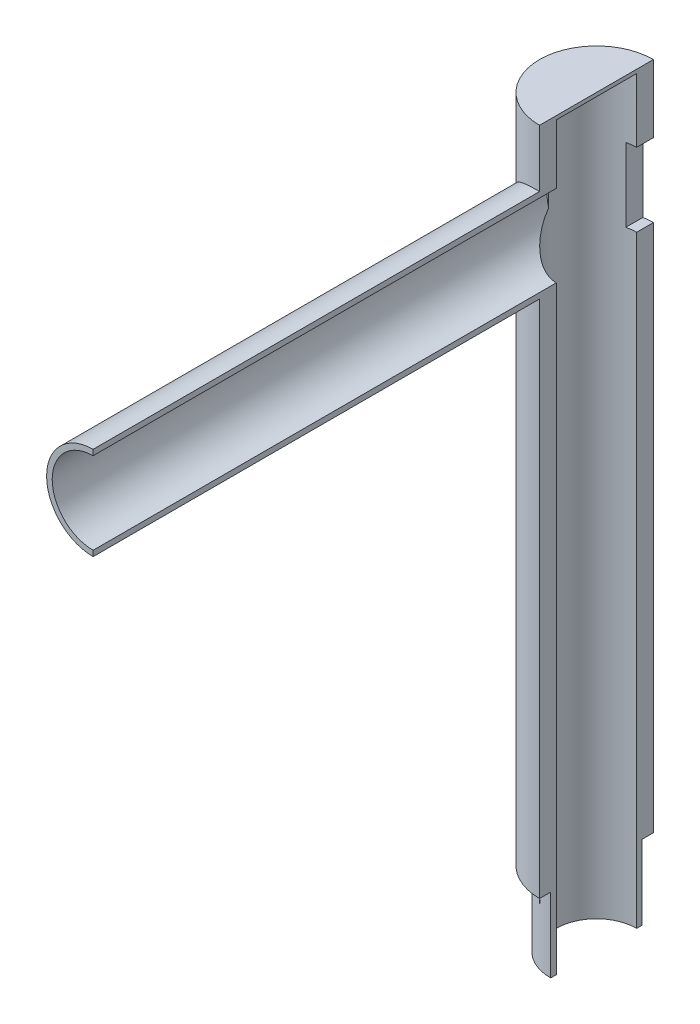
ISO-10303-21;
HEADER;
FILE_DESCRIPTION(('STEP AP214'),'2;1');
FILE_NAME('part.step','',(''),(''),'','','');
FILE_SCHEMA(('AUTOMOTIVE_DESIGN { 1 0 10303 214 1 1 1 1 }'));
ENDSEC;
DATA;
#1=APPLICATION_CONTEXT('core data for automotive mechanical design processes');
#2=APPLICATION_PROTOCOL_DEFINITION('international standard','automotive_design',2000,#1);
#3=PRODUCT_CONTEXT('',#1,'mechanical');
#4=PRODUCT('Part','Part','',(#3));
#5=PRODUCT_RELATED_PRODUCT_CATEGORY('part','',(#4));
#6=PRODUCT_DEFINITION_FORMATION('','',#4);
#7=PRODUCT_DEFINITION_CONTEXT('part definition',#1,'design');
#8=PRODUCT_DEFINITION('design','',#6,#7);
#9=PRODUCT_DEFINITION_SHAPE('','',#8);
#10=(LENGTH_UNIT() NAMED_UNIT(*) SI_UNIT(.MILLI.,.METRE.));
#11=(NAMED_UNIT(*) PLANE_ANGLE_UNIT() SI_UNIT($,.RADIAN.));
#12=(NAMED_UNIT(*) SI_UNIT($,.STERADIAN.) SOLID_ANGLE_UNIT());
#13=UNCERTAINTY_MEASURE_WITH_UNIT(LENGTH_MEASURE(1.E-05),#10,'distance_accuracy_value','');
#14=(GEOMETRIC_REPRESENTATION_CONTEXT(3) GLOBAL_UNCERTAINTY_ASSIGNED_CONTEXT((#13)) GLOBAL_UNIT_ASSIGNED_CONTEXT((#10,
#11,#12)) REPRESENTATION_CONTEXT('',''));
#15=CARTESIAN_POINT('',(0.,0.,0.));
#16=DIRECTION('',(0.,0.,1.));
#17=DIRECTION('',(1.,0.,0.));
#18=AXIS2_PLACEMENT_3D('',#15,#16,#17);
#19=CARTESIAN_POINT('',(0.,152.071263421752,2.29999999999997));
#20=DIRECTION('',(0.,0.,1.));
#21=DIRECTION('',(1.,0.,0.));
#22=AXIS2_PLACEMENT_3D('',#19,#20,#21);
#23=CYLINDRICAL_SURFACE('',#22,11.);
#24=CARTESIAN_POINT('',(10.5522509447037,155.177708335154,2.29999999999997));
#25=CARTESIAN_POINT('',(10.5325794395962,155.244545827517,2.39022890871135));
#26=CARTESIAN_POINT('',(10.5119169311885,155.312374236336,2.47948899820054));
#27=CARTESIAN_POINT('',(10.4686317795117,155.449561632855,2.65632406484075));
#28=CARTESIAN_POINT('',(10.4460094046324,155.518920410015,2.74389927072358));
#29=CARTESIAN_POINT('',(10.3752447579334,155.728590301403,3.00444668621218));
#30=CARTESIAN_POINT('',(10.3241899649672,155.870546510108,3.17530895244651));
#31=CARTESIAN_POINT('',(10.214329961665,156.156725050408,3.51268022277953));
#32=CARTESIAN_POINT('',(10.1555216928319,156.300948256383,3.67918747774226));
#33=CARTESIAN_POINT('',(10.0301142922363,156.590298486611,4.00847145573247));
#34=CARTESIAN_POINT('',(9.963514346666,156.735425603771,4.1712477869536));
#35=CARTESIAN_POINT('',(9.82173527528528,157.027075254513,4.49500286479417));
#36=CARTESIAN_POINT('',(9.74647740209153,157.173597309045,4.65594762538715));
#37=CARTESIAN_POINT('',(9.58781467372926,157.465840981898,4.97448071065244));
#38=CARTESIAN_POINT('',(9.50441003950446,157.611562621813,5.13206912620918));
#39=CARTESIAN_POINT('',(9.24178629741131,158.046550792871,5.59975910227687));
#40=CARTESIAN_POINT('',(9.0500964023228,158.33376756423,5.90492506088749));
#41=CARTESIAN_POINT('',(8.67235197004981,158.844070041434,6.44334288496607));
#42=CARTESIAN_POINT('',(8.49226828036335,159.068890195747,6.67916168210403));
#43=CARTESIAN_POINT('',(8.10880069904163,159.509858755392,7.13982919064124));
#44=CARTESIAN_POINT('',(7.90541676754832,159.726007145891,7.36467788327377));
#45=CARTESIAN_POINT('',(7.47535611002295,160.146485575914,7.80080353604577));
#46=CARTESIAN_POINT('',(7.24875786195275,160.350852007551,8.01212253817667));
#47=CARTESIAN_POINT('',(6.77118402133866,160.745766661628,8.41959160344691));
#48=CARTESIAN_POINT('',(6.52021612206553,160.936319212015,8.61574641888103));
#49=CARTESIAN_POINT('',(6.06226352104264,161.253039603587,8.94125430674856));
#50=CARTESIAN_POINT('',(5.8608375197745,161.383054514416,9.07470399829738));
#51=CARTESIAN_POINT('',(5.4446263246633,161.63237584882,9.33036289278968));
#52=CARTESIAN_POINT('',(5.2298421570312,161.751683093272,9.45257295740854));
#53=CARTESIAN_POINT('',(4.78741247080945,161.977946898627,9.68416160590853));
#54=CARTESIAN_POINT('',(4.55977506130715,162.084911119877,9.79354814902144));
#55=CARTESIAN_POINT('',(4.09222604221551,162.284896235741,9.997936810827));
#56=CARTESIAN_POINT('',(3.85231633891401,162.377919287105,10.0929411545219));
#57=CARTESIAN_POINT('',(3.400626959527,162.534695035829,10.2529808425549));
#58=CARTESIAN_POINT('',(3.19048137946224,162.60074966731,10.3203791741218));
#59=CARTESIAN_POINT('',(2.76329422824842,162.72083655146,10.4428709573228));
#60=CARTESIAN_POINT('',(2.54625392208373,162.774870995096,10.4979666514136));
#61=CARTESIAN_POINT('',(2.10654871835812,162.870014500644,10.594956987311));
#62=CARTESIAN_POINT('',(1.88388626086372,162.911129069167,10.6368572531891));
#63=CARTESIAN_POINT('',(1.43429968905322,162.979722813331,10.7067516731788));
#64=CARTESIAN_POINT('',(1.20737552728368,163.007201837049,10.7347456723507));
#65=CARTESIAN_POINT('',(0.750106280835213,163.048067090286,10.7763739087649));
#66=CARTESIAN_POINT('',(0.519751758866429,163.061401724285,10.7899555731593));
#67=CARTESIAN_POINT('',(0.0582606614796976,163.073530663905,10.8023092835417));
#68=CARTESIAN_POINT('',(-0.172875914830532,163.07232495293,10.8010813126271));
#69=CARTESIAN_POINT('',(-0.634067054804911,163.055397888123,10.7838403469286));
#70=CARTESIAN_POINT('',(-0.864121577426156,163.039675988076,10.7678267957931));
#71=CARTESIAN_POINT('',(-1.32132919193258,162.99403184081,10.7213287235555));
#72=CARTESIAN_POINT('',(-1.54848233191173,162.96410982929,10.6908444426441));
#73=CARTESIAN_POINT('',(-1.9857179142924,162.892688529604,10.6180642020343));
#74=CARTESIAN_POINT('',(-2.19604726896645,162.851925449346,10.5765192214103));
#75=CARTESIAN_POINT('',(-2.61151603222919,162.758888123986,10.4816700434353));
#76=CARTESIAN_POINT('',(-2.8166534409771,162.706609516343,10.4283613895225));
#77=CARTESIAN_POINT('',(-3.2206418204111,162.591320086985,10.3107578283266));
#78=CARTESIAN_POINT('',(-3.41949301694763,162.528309651362,10.246463316275));
#79=CARTESIAN_POINT('',(-3.81015217725626,162.392384348421,10.1077065359721));
#80=CARTESIAN_POINT('',(-4.00195872481198,162.319467503269,10.0332422372883));
#81=CARTESIAN_POINT('',(-4.44787234287718,162.13576617475,9.84554284189915));
#82=CARTESIAN_POINT('',(-4.69861409920459,162.020985078033,9.72818929350248));
#83=CARTESIAN_POINT('',(-5.1846947422479,161.776571818328,9.47806506228098));
#84=CARTESIAN_POINT('',(-5.42002900325101,161.646935227187,9.34528978235765));
#85=CARTESIAN_POINT('',(-5.87511746632607,161.374671741749,9.06611066380128));
#86=CARTESIAN_POINT('',(-6.09484731991093,161.232025306581,8.9196863166524));
#87=CARTESIAN_POINT('',(-6.51819098193618,160.935796674523,8.61517224560021));
#88=CARTESIAN_POINT('',(-6.72180421267429,160.782214086,8.4570821039272));
#89=CARTESIAN_POINT('',(-7.18510992283775,160.407492002709,8.07066859080136));
#90=CARTESIAN_POINT('',(-7.43784811692409,160.182298741531,7.83791711536191));
#91=CARTESIAN_POINT('',(-7.91416128147937,159.718267557476,7.35668085518553));
#92=CARTESIAN_POINT('',(-8.13772509978132,159.479424466702,7.10819010757031));
#93=CARTESIAN_POINT('',(-8.55697456168199,158.990942531976,6.59753875194667));
#94=CARTESIAN_POINT('',(-8.75260840920007,158.741284721171,6.33535394677884));
#95=CARTESIAN_POINT('',(-9.11650187942926,158.234593107303,5.79950894842909));
#96=CARTESIAN_POINT('',(-9.28476484464694,157.977560209394,5.52585016158046));
#97=CARTESIAN_POINT('',(-9.56772290414273,157.50456517917,5.01676973748237));
#98=CARTESIAN_POINT('',(-9.68663929564341,157.289287542193,4.78303768990129));
#99=CARTESIAN_POINT('',(-9.9069232283375,156.857853619487,4.30829376351125));
#100=CARTESIAN_POINT('',(-10.0082945314361,156.641697532306,4.06728345830798));
#101=CARTESIAN_POINT('',(-10.1471191803623,156.319737928857,3.70039054533599));
#102=CARTESIAN_POINT('',(-10.1910638658955,156.213148972824,3.5776150808096));
#103=CARTESIAN_POINT('',(-10.274723248282,156.001029365598,3.32974026256094));
#104=CARTESIAN_POINT('',(-10.3144382754163,155.895498632357,3.20464109118702));
#105=CARTESIAN_POINT('',(-10.3896609497981,155.686132675869,2.9516788576658));
#106=CARTESIAN_POINT('',(-10.4251667881221,155.582298198006,2.82381463493208));
#107=CARTESIAN_POINT('',(-10.4919183057893,155.377526588296,2.56464999859505));
#108=CARTESIAN_POINT('',(-10.5231628669799,155.276590222373,2.43334869383829));
#109=CARTESIAN_POINT('',(-10.5522509447037,155.177708335154,2.29999999999999));
#110=B_SPLINE_CURVE_WITH_KNOTS('',3,(#24,#25,#26,#27,#28,#29,#30,#31,#32,#33,#34,#35,#36,#37,
#38,#39,#40,#41,#42,#43,#44,#45,#46,#47,#48,#49,#50,#51,#52,#53,#54,#55,#56,#57,#58,#59,#60,#61,
#62,#63,#64,#65,#66,#67,#68,#69,#70,#71,#72,#73,#74,#75,#76,#77,#78,#79,#80,#81,#82,#83,#84,#85,
#86,#87,#88,#89,#90,#91,#92,#93,#94,#95,#96,#97,#98,#99,#100,#101,#102,#103,#104,#105,#106,#107,
#108,#109),.UNSPECIFIED.,.F.,.F.,(4,2,2,2,2,2,2,2,2,2,2,2,2,2,2,2,2,2,2,2,2,2,2,2,2,2,2,2,2,2,2,
2,2,2,2,2,2,2,2,2,2,2,4),(0.,0.341957308564042,0.683867862309217,1.36742874854596,
2.05126008887394,2.73516291635746,3.42586851236266,4.11655538132878,5.49733557733101,
6.61328280349764,7.72923193866366,8.84152576759949,9.95346959037174,10.7759369361276,
11.5983411755479,12.420232236443,13.24199601622,13.9323923502305,14.6226627397019,
15.3126385270925,16.0026220018208,16.6951138138953,17.3876064163319,18.0801250769356,
18.7726322432572,19.4266354714296,20.0808868894934,20.735114774897,21.3894734705863,
22.2872385559013,23.18527194819,24.0846771334249,24.9841145433611,26.2147110708523,
27.4457766355021,28.6790963511875,29.9122653417687,30.9296235336439,31.9467633191438,
32.451973630868,32.9571444633034,33.4625316148263,33.968051125063),.UNSPECIFIED.);
#111=CARTESIAN_POINT('',(0.,163.071263421752,10.8));
#112=VERTEX_POINT('',#111);
#113=CARTESIAN_POINT('',(-10.5522509447037,155.177708335154,2.29999999999997));
#114=VERTEX_POINT('',#113);
#115=EDGE_CURVE('E210',#112,#114,#110,.T.);
#116=ORIENTED_EDGE('',*,*,#115,.F.);
#117=DIRECTION('',(0.,0.,1.));
#118=VECTOR('',#117,1.);
#119=CARTESIAN_POINT('',(0.,163.071263421752,80.3));
#120=LINE('',#119,#118);
#121=CARTESIAN_POINT('',(0.,163.071263421752,135.3));
#122=VERTEX_POINT('',#121);
#123=EDGE_CURVE('E181',#112,#122,#120,.T.);
#124=ORIENTED_EDGE('',*,*,#123,.T.);
#125=CARTESIAN_POINT('',(0.,152.071263421752,135.3));
#126=DIRECTION('',(0.,0.,1.));
#127=DIRECTION('',(1.,0.,0.));
#128=AXIS2_PLACEMENT_3D('',#125,#126,#127);
#129=CIRCLE('',#128,11.);
#130=CARTESIAN_POINT('',(0.,141.071263421752,135.3));
#131=VERTEX_POINT('',#130);
#132=EDGE_CURVE('E183',#122,#131,#129,.T.);
#133=ORIENTED_EDGE('',*,*,#132,.T.);
#134=DIRECTION('',(0.,0.,1.));
#135=VECTOR('',#134,1.);
#136=CARTESIAN_POINT('',(0.,141.071263421752,80.3));
#137=LINE('',#136,#135);
#138=CARTESIAN_POINT('',(0.,141.071263421752,10.8));
#139=VERTEX_POINT('',#138);
#140=EDGE_CURVE('E53',#139,#131,#137,.T.);
#141=ORIENTED_EDGE('',*,*,#140,.F.);
#142=CARTESIAN_POINT('',(-10.5522509447037,148.96481850835,2.29999999999997));
#143=CARTESIAN_POINT('',(-10.5325794395962,148.897981015988,2.39022890871134));
#144=CARTESIAN_POINT('',(-10.5119169311885,148.830152607168,2.47948899820053));
#145=CARTESIAN_POINT('',(-10.4686317795117,148.692965210649,2.65632406484074));
#146=CARTESIAN_POINT('',(-10.4460094046324,148.623606433489,2.74389927072357));
#147=CARTESIAN_POINT('',(-10.3752447579334,148.413936542102,3.00444668621218));
#148=CARTESIAN_POINT('',(-10.3241899649672,148.271980333397,3.17530895244651));
#149=CARTESIAN_POINT('',(-10.214329961665,147.985801793096,3.51268022277953));
#150=CARTESIAN_POINT('',(-10.1555216928319,147.841578587121,3.67918747774227));
#151=CARTESIAN_POINT('',(-10.0301142922363,147.552228356894,4.00847145573248));
#152=CARTESIAN_POINT('',(-9.963514346666,147.407101239733,4.17124778695361));
#153=CARTESIAN_POINT('',(-9.82173527528528,147.115451588991,4.49500286479418));
#154=CARTESIAN_POINT('',(-9.74647740209153,146.96892953446,4.65594762538716));
#155=CARTESIAN_POINT('',(-9.58781467372926,146.676685861607,4.97448071065245));
#156=CARTESIAN_POINT('',(-9.50441003950445,146.530964221692,5.13206912620919));
#157=CARTESIAN_POINT('',(-9.24178629741129,146.095976050633,5.59975910227689));
#158=CARTESIAN_POINT('',(-9.05009640232279,145.808759279275,5.9049250608875));
#159=CARTESIAN_POINT('',(-8.6723519700498,145.298456802071,6.44334288496607));
#160=CARTESIAN_POINT('',(-8.49226828036334,145.073636647758,6.67916168210404));
#161=CARTESIAN_POINT('',(-8.10880069904162,144.632668088112,7.13982919064125));
#162=CARTESIAN_POINT('',(-7.90541676754831,144.416519697614,7.36467788327378));
#163=CARTESIAN_POINT('',(-7.47535611002296,143.996041267591,7.80080353604576));
#164=CARTESIAN_POINT('',(-7.24875786195276,143.791674835953,8.01212253817667));
#165=CARTESIAN_POINT('',(-6.77118402133867,143.396760181877,8.4195916034469));
#166=CARTESIAN_POINT('',(-6.52021612206554,143.206207631489,8.61574641888103));
#167=CARTESIAN_POINT('',(-6.06226352104264,142.889487239918,8.94125430674856));
#168=CARTESIAN_POINT('',(-5.8608375197745,142.759472329089,9.07470399829738));
#169=CARTESIAN_POINT('',(-5.4446263246633,142.510150994684,9.33036289278968));
#170=CARTESIAN_POINT('',(-5.2298421570312,142.390843750233,9.45257295740854));
#171=CARTESIAN_POINT('',(-4.78741247080945,142.164579944877,9.68416160590853));
#172=CARTESIAN_POINT('',(-4.55977506130715,142.057615723627,9.79354814902144));
#173=CARTESIAN_POINT('',(-4.09222604221551,141.857630607764,9.997936810827));
#174=CARTESIAN_POINT('',(-3.85231633891401,141.7646075564,10.0929411545219));
#175=CARTESIAN_POINT('',(-3.400626959527,141.607831807676,10.2529808425549));
#176=CARTESIAN_POINT('',(-3.19048137946224,141.541777176195,10.3203791741218));
#177=CARTESIAN_POINT('',(-2.76329422824842,141.421690292044,10.4428709573228));
#178=CARTESIAN_POINT('',(-2.54625392208373,141.367655848408,10.4979666514136));
#179=CARTESIAN_POINT('',(-2.10654871835813,141.27251234286,10.594956987311));
#180=CARTESIAN_POINT('',(-1.88388626086373,141.231397774337,10.6368572531891));
#181=CARTESIAN_POINT('',(-1.43429968905323,141.162804030173,10.7067516731788));
#182=CARTESIAN_POINT('',(-1.20737552728368,141.135325006455,10.7347456723507));
#183=CARTESIAN_POINT('',(-0.750106280835213,141.094459753219,10.7763739087649));
#184=CARTESIAN_POINT('',(-0.519751758866429,141.081125119219,10.7899555731593));
#185=CARTESIAN_POINT('',(-0.0582606614796977,141.068996179599,10.8023092835417));
#186=CARTESIAN_POINT('',(0.172875914830531,141.070201890574,10.8010813126271));
#187=CARTESIAN_POINT('',(0.634067054804913,141.087128955381,10.7838403469286));
#188=CARTESIAN_POINT('',(0.86412157742616,141.102850855428,10.7678267957931));
#189=CARTESIAN_POINT('',(1.32132919193258,141.148495002694,10.7213287235555));
#190=CARTESIAN_POINT('',(1.54848233191173,141.178417014215,10.6908444426441));
#191=CARTESIAN_POINT('',(1.9857179142924,141.2498383139,10.6180642020343));
#192=CARTESIAN_POINT('',(2.19604726896645,141.290601394159,10.5765192214103));
#193=CARTESIAN_POINT('',(2.61151603222919,141.383638719519,10.4816700434353));
#194=CARTESIAN_POINT('',(2.8166534409771,141.435917327161,10.4283613895225));
#195=CARTESIAN_POINT('',(3.2206418204111,141.55120675652,10.3107578283266));
#196=CARTESIAN_POINT('',(3.41949301694763,141.614217192143,10.246463316275));
#197=CARTESIAN_POINT('',(3.81015217725626,141.750142495084,10.1077065359721));
#198=CARTESIAN_POINT('',(4.00195872481198,141.823059340235,10.0332422372883));
#199=CARTESIAN_POINT('',(4.44787234287718,142.006760668755,9.84554284189915));
#200=CARTESIAN_POINT('',(4.69861409920459,142.121541765471,9.72818929350248));
#201=CARTESIAN_POINT('',(5.1846947422479,142.365955025176,9.47806506228098));
#202=CARTESIAN_POINT('',(5.42002900325101,142.495591616317,9.34528978235765));
#203=CARTESIAN_POINT('',(5.87511746632606,142.767855101755,9.06611066380128));
#204=CARTESIAN_POINT('',(6.09484731991091,142.910501536923,8.91968631665241));
#205=CARTESIAN_POINT('',(6.51819098193616,143.206730168982,8.61517224560022));
#206=CARTESIAN_POINT('',(6.72180421267428,143.360312757505,8.4570821039272));
#207=CARTESIAN_POINT('',(7.18510992283775,143.735034840795,8.07066859080136));
#208=CARTESIAN_POINT('',(7.43784811692409,143.960228101973,7.83791711536191));
#209=CARTESIAN_POINT('',(7.91416128147938,144.424259286029,7.35668085518553));
#210=CARTESIAN_POINT('',(8.13772509978132,144.663102376803,7.10819010757031));
#211=CARTESIAN_POINT('',(8.55697456168199,145.151584311529,6.59753875194667));
#212=CARTESIAN_POINT('',(8.75260840920007,145.401242122333,6.33535394677884));
#213=CARTESIAN_POINT('',(9.11650187942926,145.907933736202,5.79950894842909));
#214=CARTESIAN_POINT('',(9.28476484464694,146.16496663411,5.52585016158046));
#215=CARTESIAN_POINT('',(9.56772290414273,146.637961664335,5.01676973748237));
#216=CARTESIAN_POINT('',(9.68663929564341,146.853239301311,4.78303768990129));
#217=CARTESIAN_POINT('',(9.9069232283375,147.284673224018,4.30829376351125));
#218=CARTESIAN_POINT('',(10.0082945314361,147.500829311198,4.06728345830798));
#219=CARTESIAN_POINT('',(10.1471191803623,147.822788914647,3.70039054533599));
#220=CARTESIAN_POINT('',(10.1910638658955,147.929377870681,3.5776150808096));
#221=CARTESIAN_POINT('',(10.274723248282,148.141497477906,3.32974026256094));
#222=CARTESIAN_POINT('',(10.3144382754163,148.247028211148,3.20464109118703));
#223=CARTESIAN_POINT('',(10.3896609497981,148.456394167636,2.9516788576658));
#224=CARTESIAN_POINT('',(10.4251667881221,148.560228645499,2.82381463493208));
#225=CARTESIAN_POINT('',(10.4919183057893,148.765000255209,2.56464999859504));
#226=CARTESIAN_POINT('',(10.5231628669799,148.865936621132,2.43334869383829));
#227=CARTESIAN_POINT('',(10.5522509447037,148.96481850835,2.29999999999999));
#228=B_SPLINE_CURVE_WITH_KNOTS('',3,(#142,#143,#144,#145,#146,#147,#148,#149,#150,#151,#152,
#153,#154,#155,#156,#157,#158,#159,#160,#161,#162,#163,#164,#165,#166,#167,#168,#169,#170,#171,
#172,#173,#174,#175,#176,#177,#178,#179,#180,#181,#182,#183,#184,#185,#186,#187,#188,#189,#190,
#191,#192,#193,#194,#195,#196,#197,#198,#199,#200,#201,#202,#203,#204,#205,#206,#207,#208,#209,
#210,#211,#212,#213,#214,#215,#216,#217,#218,#219,#220,#221,#222,#223,#224,#225,#226,#227),
.UNSPECIFIED.,.F.,.F.,(4,2,2,2,2,2,2,2,2,2,2,2,2,2,2,2,2,2,2,2,2,2,2,2,2,2,2,2,2,2,2,2,2,2,2,2,
2,2,2,2,2,2,4),(0.,0.34195730856403,0.683867862309216,1.36742874854596,2.05126008887398,
2.73516291635746,3.42586851236267,4.1165553813288,5.49733557733101,6.61328280349767,
7.72923193866366,8.84152576759948,9.95346959037174,10.7759369361276,11.5983411755479,
12.420232236443,13.24199601622,13.9323923502305,14.6226627397019,15.3126385270925,
16.0026220018208,16.6951138138953,17.3876064163319,18.0801250769356,18.7726322432572,
19.4266354714296,20.0808868894934,20.735114774897,21.3894734705863,22.2872385559013,
23.18527194819,24.0846771334248,24.9841145433611,26.2147110708523,27.4457766355021,
28.6790963511875,29.9122653417687,30.929623533644,31.9467633191438,32.451973630868,
32.9571444633035,33.4625316148263,33.9680511250631),.UNSPECIFIED.);
#229=CARTESIAN_POINT('',(-10.5522509447037,148.96481850835,2.29999999999997));
#230=VERTEX_POINT('',#229);
#231=EDGE_CURVE('E263',#230,#139,#228,.T.);
#232=ORIENTED_EDGE('',*,*,#231,.F.);
#233=CARTESIAN_POINT('',(0.,152.071263421752,2.29999999999997));
#234=DIRECTION('',(0.,0.,1.));
#235=DIRECTION('',(1.,0.,0.));
#236=AXIS2_PLACEMENT_3D('',#233,#234,#235);
#237=CIRCLE('',#236,11.);
#238=EDGE_CURVE('E185',#114,#230,#237,.T.);
#239=ORIENTED_EDGE('',*,*,#238,.F.);
#240=EDGE_LOOP('',(#116,#124,#133,#141,#232,#239));
#241=FACE_BOUND('',#240,.T.);
#242=ADVANCED_FACE('F37',(#241),#23,.F.);
#243=CARTESIAN_POINT('',(0.,210.547012947259,0.));
#244=DIRECTION('',(0.,-1.,0.));
#245=DIRECTION('',(0.,0.,-1.));
#246=AXIS2_PLACEMENT_3D('',#243,#244,#245);
#247=CYLINDRICAL_SURFACE('',#246,10.8);
#248=CARTESIAN_POINT('',(0.,179.,0.));
#249=DIRECTION('',(0.,1.,0.));
#250=DIRECTION('',(0.,0.,1.));
#251=AXIS2_PLACEMENT_3D('',#248,#249,#250);
#252=CIRCLE('',#251,10.8);
#253=CARTESIAN_POINT('',(0.,179.,10.8));
#254=VERTEX_POINT('',#253);
#255=CARTESIAN_POINT('',(0.,179.,-10.8));
#256=VERTEX_POINT('',#255);
#257=EDGE_CURVE('E193',#254,#256,#252,.F.);
#258=ORIENTED_EDGE('',*,*,#257,.F.);
#259=DIRECTION('',(0.,-1.,0.));
#260=VECTOR('',#259,1.);
#261=CARTESIAN_POINT('',(0.,210.547012947259,10.8));
#262=LINE('',#261,#260);
#263=EDGE_CURVE('E61',#254,#112,#262,.T.);
#264=ORIENTED_EDGE('',*,*,#263,.T.);
#265=ORIENTED_EDGE('',*,*,#115,.T.);
#266=DIRECTION('',(0.,-1.,0.));
#267=VECTOR('',#266,1.);
#268=CARTESIAN_POINT('',(-10.5522509447037,210.547012947259,2.29999999999997));
#269=LINE('',#268,#267);
#270=EDGE_CURVE('E46',#230,#114,#269,.F.);
#271=ORIENTED_EDGE('',*,*,#270,.F.);
#272=ORIENTED_EDGE('',*,*,#231,.T.);
#273=DIRECTION('',(0.,-1.,0.));
#274=VECTOR('',#273,1.);
#275=CARTESIAN_POINT('',(0.,210.547012947259,10.8));
#276=LINE('',#275,#274);
#277=CARTESIAN_POINT('',(0.,-20.,10.8));
#278=VERTEX_POINT('',#277);
#279=EDGE_CURVE('E275',#139,#278,#276,.T.);
#280=ORIENTED_EDGE('',*,*,#279,.T.);
#281=CARTESIAN_POINT('',(0.,-20.,0.));
#282=DIRECTION('',(0.,-1.,0.));
#283=DIRECTION('',(0.,0.,-1.));
#284=AXIS2_PLACEMENT_3D('',#281,#282,#283);
#285=CIRCLE('',#284,10.8);
#286=CARTESIAN_POINT('',(0.,-20.,-10.8));
#287=VERTEX_POINT('',#286);
#288=EDGE_CURVE('E188',#278,#287,#285,.T.);
#289=ORIENTED_EDGE('',*,*,#288,.T.);
#290=DIRECTION('',(0.,-1.,0.));
#291=VECTOR('',#290,1.);
#292=CARTESIAN_POINT('',(0.,210.547012947259,-10.8));
#293=LINE('',#292,#291);
#294=CARTESIAN_POINT('',(0.,142.047887238928,-10.8));
#295=VERTEX_POINT('',#294);
#296=EDGE_CURVE('E278',#287,#295,#293,.F.);
#297=ORIENTED_EDGE('',*,*,#296,.T.);
#298=CARTESIAN_POINT('',(0.,142.047887238928,0.));
#299=DIRECTION('',(0.,1.,0.));
#300=DIRECTION('',(0.,0.,1.));
#301=AXIS2_PLACEMENT_3D('',#298,#299,#300);
#302=CIRCLE('',#301,10.8);
#303=CARTESIAN_POINT('',(-2.60470390333001,142.047887238928,-10.481198289126));
#304=VERTEX_POINT('',#303);
#305=EDGE_CURVE('E302',#304,#295,#302,.F.);
#306=ORIENTED_EDGE('',*,*,#305,.F.);
#307=DIRECTION('',(0.,-1.,0.));
#308=VECTOR('',#307,1.);
#309=CARTESIAN_POINT('',(-2.60470390333001,210.547012947259,-10.481198289126));
#310=LINE('',#309,#308);
#311=CARTESIAN_POINT('',(-2.60470390333001,161.806579981511,-10.481198289126));
#312=VERTEX_POINT('',#311);
#313=EDGE_CURVE('E178',#304,#312,#310,.F.);
#314=ORIENTED_EDGE('',*,*,#313,.T.);
#315=CARTESIAN_POINT('',(0.,161.806579981511,0.));
#316=DIRECTION('',(0.,1.,0.));
#317=DIRECTION('',(0.,0.,1.));
#318=AXIS2_PLACEMENT_3D('',#315,#316,#317);
#319=CIRCLE('',#318,10.8);
#320=CARTESIAN_POINT('',(0.,161.806579981511,-10.8));
#321=VERTEX_POINT('',#320);
#322=EDGE_CURVE('E155',#312,#321,#319,.F.);
#323=ORIENTED_EDGE('',*,*,#322,.T.);
#324=DIRECTION('',(0.,-1.,0.));
#325=VECTOR('',#324,1.);
#326=CARTESIAN_POINT('',(0.,210.547012947259,-10.8));
#327=LINE('',#326,#325);
#328=EDGE_CURVE('E162',#321,#256,#327,.F.);
#329=ORIENTED_EDGE('',*,*,#328,.T.);
#330=EDGE_LOOP('',(#258,#264,#265,#271,#272,#280,#289,#297,#306,#314,#323,#329));
#331=FACE_BOUND('',#330,.T.);
#332=ADVANCED_FACE('F228',(#331),#247,.F.);
#333=CARTESIAN_POINT('',(0.,152.071263421752,6.29999999999999));
#334=DIRECTION('',(0.,0.,1.));
#335=DIRECTION('',(1.,0.,0.));
#336=AXIS2_PLACEMENT_3D('',#333,#334,#335);
#337=CYLINDRICAL_SURFACE('',#336,12.5);
#338=DIRECTION('',(0.,0.,1.));
#339=VECTOR('',#338,1.);
#340=CARTESIAN_POINT('',(0.,164.571263421752,6.29999999999999));
#341=LINE('',#340,#339);
#342=CARTESIAN_POINT('',(0.,164.571263421752,15.3));
#343=VERTEX_POINT('',#342);
#344=CARTESIAN_POINT('',(0.,164.571263421752,135.3));
#345=VERTEX_POINT('',#344);
#346=EDGE_CURVE('E172',#343,#345,#341,.T.);
#347=ORIENTED_EDGE('',*,*,#346,.F.);
#348=CARTESIAN_POINT('',(0.,139.571263421752,15.3));
#349=CARTESIAN_POINT('',(-0.298374339876178,139.571265616567,15.2999978541843));
#350=CARTESIAN_POINT('',(-0.596787515840639,139.581965801576,15.2912524043229));
#351=CARTESIAN_POINT('',(-1.19120346048576,139.624581247192,15.2564658136912));
#352=CARTESIAN_POINT('',(-1.48720491353678,139.65650739267,15.2304157989848));
#353=CARTESIAN_POINT('',(-2.07481280558748,139.741079966748,15.1615573200778));
#354=CARTESIAN_POINT('',(-2.36641004491406,139.793764827998,15.1187177725544));
#355=CARTESIAN_POINT('',(-2.94245458551095,139.918945062988,15.0172400906571));
#356=CARTESIAN_POINT('',(-3.22690264798121,139.991438317812,14.9586036460963));
#357=CARTESIAN_POINT('',(-3.78505344798714,140.154578881056,14.8271727415037));
#358=CARTESIAN_POINT('',(-4.05881391207162,140.245105396444,14.7544725741044));
#359=CARTESIAN_POINT('',(-4.59610515386519,140.443373268496,14.5960363816613));
#360=CARTESIAN_POINT('',(-4.85963588039461,140.551114711273,14.5103002914089));
#361=CARTESIAN_POINT('',(-5.37533786747197,140.782525434572,14.3272674358369));
#362=CARTESIAN_POINT('',(-5.62751173931635,140.906191028133,14.2299733469729));
#363=CARTESIAN_POINT('',(-6.11983630688211,141.168263541297,14.025288355859));
#364=CARTESIAN_POINT('',(-6.3599844786781,141.306673536516,13.9178953475698));
#365=CARTESIAN_POINT('',(-6.91156408391224,141.649165805729,13.6544567689663));
#366=CARTESIAN_POINT('',(-7.21769896697315,141.859007079506,13.4947680553461));
#367=CARTESIAN_POINT('',(-7.8060710932396,142.301369398334,13.1631826015375));
#368=CARTESIAN_POINT('',(-8.08830038311991,142.533897936438,12.9912818331341));
#369=CARTESIAN_POINT('',(-8.62920357143536,143.020324453091,12.6384872282878));
#370=CARTESIAN_POINT('',(-8.88781366136161,143.274276948996,12.45757095957));
#371=CARTESIAN_POINT('',(-9.38049018290741,143.801642889878,12.0909335705133));
#372=CARTESIAN_POINT('',(-9.61455956874439,144.075053985754,11.9052130318773));
#373=CARTESIAN_POINT('',(-10.0618588346643,144.645456217287,11.5297732524285));
#374=CARTESIAN_POINT('',(-10.2746655382669,144.942769821464,11.3400398084624));
#375=CARTESIAN_POINT('',(-10.674535292142,145.55677404181,10.9644661177223));
#376=CARTESIAN_POINT('',(-10.8615898735228,145.873470983194,10.7786271686518));
#377=CARTESIAN_POINT('',(-11.2086159492742,146.52571665925,10.417269025757));
#378=CARTESIAN_POINT('',(-11.3686563839635,146.861214404181,10.2417243325119));
#379=CARTESIAN_POINT('',(-11.660631521728,147.552391696343,9.90801260656117));
#380=CARTESIAN_POINT('',(-11.7925904278072,147.908053526862,9.74983066659784));
#381=CARTESIAN_POINT('',(-11.9746380845536,148.479000208744,9.52412568877465));
#382=CARTESIAN_POINT('',(-12.0352240117253,148.687303526538,9.44730620408402));
#383=CARTESIAN_POINT('',(-12.1461986246947,149.110241104394,9.30419505001983));
#384=CARTESIAN_POINT('',(-12.1965860241261,149.324876159187,9.23790470894081));
#385=CARTESIAN_POINT('',(-12.286369498164,149.759499919969,9.11815393398126));
#386=CARTESIAN_POINT('',(-12.3257877265407,149.979476845259,9.06466767148061));
#387=CARTESIAN_POINT('',(-12.3930474651945,150.424174927056,8.97249360201214));
#388=CARTESIAN_POINT('',(-12.4208949407409,150.648893576031,8.93379817049879));
#389=CARTESIAN_POINT('',(-12.4646593000377,151.104240902967,8.87263860624257));
#390=CARTESIAN_POINT('',(-12.4804425091985,151.334907327287,8.85035643137841));
#391=CARTESIAN_POINT('',(-12.4991543473124,151.797797310173,8.82391133271879));
#392=CARTESIAN_POINT('',(-12.5020838579106,152.030020760847,8.8197471661953));
#393=CARTESIAN_POINT('',(-12.4950056950293,152.493968914287,8.82977163403035));
#394=CARTESIAN_POINT('',(-12.4849924379903,152.725693358572,8.84396818927599));
#395=CARTESIAN_POINT('',(-12.4522959946743,153.186479108982,8.88994411696668));
#396=CARTESIAN_POINT('',(-12.4296111049328,153.415540052822,8.92172585340567));
#397=CARTESIAN_POINT('',(-12.3685899198947,153.89716217718,9.00616466248163));
#398=CARTESIAN_POINT('',(-12.3286741145997,154.149156277606,9.0609054467276));
#399=CARTESIAN_POINT('',(-12.2345755093236,154.645979290105,9.18756758324148));
#400=CARTESIAN_POINT('',(-12.1803899931029,154.890806828154,9.25949220621126));
#401=CARTESIAN_POINT('',(-11.9976493611205,155.614475694207,9.49662933313653));
#402=CARTESIAN_POINT('',(-11.8490501479323,156.081453503937,9.68299707574882));
#403=CARTESIAN_POINT('',(-11.544599263258,156.878617887036,10.0426388055177));
#404=CARTESIAN_POINT('',(-11.398140902608,157.215702279535,10.2091956809328));
#405=CARTESIAN_POINT('',(-11.0790854908984,157.870968821975,10.5545779071589));
#406=CARTESIAN_POINT('',(-10.9064747428785,158.189140944571,10.7334096597677));
#407=CARTESIAN_POINT('',(-10.5359818020872,158.807220254065,11.097326873673));
#408=CARTESIAN_POINT('',(-10.3380676945577,159.107103655709,11.2824200117263));
#409=CARTESIAN_POINT('',(-9.91764816121619,159.688271893549,11.6537081530025));
#410=CARTESIAN_POINT('',(-9.69514722298676,159.969560108804,11.8399029492986));
#411=CARTESIAN_POINT('',(-9.21674739993304,160.523515017813,12.2162890361156));
#412=CARTESIAN_POINT('',(-8.95989816731842,160.795443317551,12.406361770326));
#413=CARTESIAN_POINT('',(-8.41991835060471,161.317669988184,12.7789906754421));
#414=CARTESIAN_POINT('',(-8.136783808852,161.56796509088,12.9615457084508));
#415=CARTESIAN_POINT('',(-7.54512772465424,162.044478325717,13.3146345910869));
#416=CARTESIAN_POINT('',(-7.23666135776264,162.2707464476,13.4851931400833));
#417=CARTESIAN_POINT('',(-6.59449008147708,162.697227569189,13.8105803414398));
#418=CARTESIAN_POINT('',(-6.26079550955797,162.897451150354,13.9654153763561));
#419=CARTESIAN_POINT('',(-5.6636019615077,163.218244123525,14.2157682739175));
#420=CARTESIAN_POINT('',(-5.40571718180407,163.345661026274,14.3159607622627));
#421=CARTESIAN_POINT('',(-4.87810075241635,163.583771897618,14.5042246764047));
#422=CARTESIAN_POINT('',(-4.60837202863618,163.694469966735,14.5922990738543));
#423=CARTESIAN_POINT('',(-4.05829584555437,163.897766213774,14.7547428210784));
#424=CARTESIAN_POINT('',(-3.77795315853221,163.990372413499,14.8291182440378));
#425=CARTESIAN_POINT('',(-3.20804935528157,164.156232601779,14.9627559648233));
#426=CARTESIAN_POINT('',(-2.91848804105372,164.229486174359,15.0220179377933));
#427=CARTESIAN_POINT('',(-2.3301818926148,164.35586103571,15.124482147548));
#428=CARTESIAN_POINT('',(-2.03138995855804,164.408849761471,15.1675786031877));
#429=CARTESIAN_POINT('',(-1.4287400282537,164.493069248937,15.2361629506826));
#430=CARTESIAN_POINT('',(-1.12488203345181,164.52430001685,15.2616508475627));
#431=CARTESIAN_POINT('',(-0.514799964328684,164.564397734893,15.2943869027742));
#432=CARTESIAN_POINT('',(-0.208576613726045,164.573271273326,15.3016404344687));
#433=CARTESIAN_POINT('',(0.403562477714562,164.568495168922,15.2977383258199));
#434=CARTESIAN_POINT('',(0.70947823998732,164.554847222727,15.2865840722155));
#435=CARTESIAN_POINT('',(1.2879443485816,164.507776319673,15.2481701605316));
#436=CARTESIAN_POINT('',(1.56078449237629,164.47645725377,15.2226243646794));
#437=CARTESIAN_POINT('',(2.1021280469769,164.39627524457,15.1573537743946));
#438=CARTESIAN_POINT('',(2.37063180286406,164.347413704529,15.1176301140777));
#439=CARTESIAN_POINT('',(2.90166435211479,164.232848166309,15.0247469200404));
#440=CARTESIAN_POINT('',(3.16419251628778,164.167142403394,14.9715859785307));
#441=CARTESIAN_POINT('',(3.68182495427382,164.019761013317,14.8527672381658));
#442=CARTESIAN_POINT('',(3.93692881370504,163.938084496715,14.7871087433056));
#443=CARTESIAN_POINT('',(4.44842467144107,163.756214199462,14.6415499564959));
#444=CARTESIAN_POINT('',(4.70447078412098,163.655417228728,14.5611901622059));
#445=CARTESIAN_POINT('',(5.20633604801882,163.438708860986,14.3893868261482));
#446=CARTESIAN_POINT('',(5.45215114982324,163.322791553026,14.2979389507379));
#447=CARTESIAN_POINT('',(5.93267456088872,163.07699800549,14.1053309945325));
#448=CARTESIAN_POINT('',(6.16738450292039,162.94712382721,14.0041723481597));
#449=CARTESIAN_POINT('',(6.62525105811648,162.674427095891,13.7934620010814));
#450=CARTESIAN_POINT('',(6.84840538693887,162.531601997918,13.6839086514243));
#451=CARTESIAN_POINT('',(7.38085092948265,162.166760488884,13.4066882448176));
#452=CARTESIAN_POINT('',(7.68357575874427,161.938090042986,13.2351037599383));
#453=CARTESIAN_POINT('',(8.26344127760932,161.457816963948,12.8810339273147));
#454=CARTESIAN_POINT('',(8.54057204290485,161.206205509772,12.6985443958491));
#455=CARTESIAN_POINT('',(9.06999055418889,160.680844068109,12.3260052762406));
#456=CARTESIAN_POINT('',(9.32217978151698,160.407013502349,12.1359295690552));
#457=CARTESIAN_POINT('',(9.80036289156974,159.839188751211,11.753155003834));
#458=CARTESIAN_POINT('',(10.0263607494716,159.545197636495,11.560456548838));
#459=CARTESIAN_POINT('',(10.455528837433,158.93232968087,11.17392755039));
#460=CARTESIAN_POINT('',(10.658254570564,158.61311911703,10.9801318858727));
#461=CARTESIAN_POINT('',(11.0358680771557,157.953780651221,10.6005317395655));
#462=CARTESIAN_POINT('',(11.2107422164529,157.613642616901,10.4147312039046));
#463=CARTESIAN_POINT('',(11.530364723109,156.913587301974,10.0596932537264));
#464=CARTESIAN_POINT('',(11.6752561852193,156.553774843856,9.89037930849304));
#465=CARTESIAN_POINT('',(11.9334344735739,155.81248146887,9.57727913837728));
#466=CARTESIAN_POINT('',(12.0467643109157,155.43103090201,9.43345827059683));
#467=CARTESIAN_POINT('',(12.1921885992208,154.836100214553,9.24376848124907));
#468=CARTESIAN_POINT('',(12.2371335175886,154.630105216038,9.18406451856352));
#469=CARTESIAN_POINT('',(12.3169593409582,154.213115610752,9.07672746620472));
#470=CARTESIAN_POINT('',(12.3518444812587,154.002123148586,9.02908929770468));
#471=CARTESIAN_POINT('',(12.4109070290525,153.576409786139,8.94773293493123));
#472=CARTESIAN_POINT('',(12.4351057022615,153.361697182289,8.91398710452532));
#473=CARTESIAN_POINT('',(12.4723924235245,152.929442496189,8.86174177337364));
#474=CARTESIAN_POINT('',(12.4854805835827,152.711900442486,8.84324211893246));
#475=CARTESIAN_POINT('',(12.5002730806819,152.274495512311,8.82232081870693));
#476=CARTESIAN_POINT('',(12.5019171018151,152.054626446978,8.81998436084844));
#477=CARTESIAN_POINT('',(12.4936203552716,151.615558114594,8.83173247659283));
#478=CARTESIAN_POINT('',(12.4836797451835,151.396358838474,8.84581682681931));
#479=CARTESIAN_POINT('',(12.4524384884771,150.960108787662,8.88974088681187));
#480=CARTESIAN_POINT('',(12.4311237886637,150.743061009887,8.91960008665224));
#481=CARTESIAN_POINT('',(12.3775841490026,150.312718270991,8.99374718580146));
#482=CARTESIAN_POINT('',(12.3453524455102,150.099425722818,9.03804402932913));
#483=CARTESIAN_POINT('',(12.2592821492206,149.614091744691,9.15460049009959));
#484=CARTESIAN_POINT('',(12.201858499146,149.343742926993,9.23126449606267));
#485=CARTESIAN_POINT('',(12.0708651556229,148.81255918981,9.40190180385767));
#486=CARTESIAN_POINT('',(11.9972865650348,148.551729605605,9.4958846392254));
#487=CARTESIAN_POINT('',(11.8349951530187,148.039482877907,9.69740450423416));
#488=CARTESIAN_POINT('',(11.7462458270852,147.788090264521,9.80497405990293));
#489=CARTESIAN_POINT('',(11.5546828832052,147.295368125795,10.0300132415594));
#490=CARTESIAN_POINT('',(11.4518688935691,147.054038866621,10.1474831291535));
#491=CARTESIAN_POINT('',(11.1784571529859,146.463746107502,10.4494782949695));
#492=CARTESIAN_POINT('',(10.9995486357003,146.120828836714,10.6383403069003));
#493=CARTESIAN_POINT('',(10.6130954569287,145.456125383841,11.0239221659798));
#494=CARTESIAN_POINT('',(10.4055381255803,145.134348644548,11.22064546226));
#495=CARTESIAN_POINT('',(9.9622299571128,144.511488114641,11.6160360710378));
#496=CARTESIAN_POINT('',(9.72645079029461,144.21042560286,11.8147051499879));
#497=CARTESIAN_POINT('',(9.22715425512043,143.629927894839,12.2086346633533));
#498=CARTESIAN_POINT('',(8.96364167289568,143.350488981274,12.4038956791609));
#499=CARTESIAN_POINT('',(8.4048305247685,142.810486052158,12.7892819436488));
#500=CARTESIAN_POINT('',(8.10911859283769,142.550263333163,12.9792881154821));
#501=CARTESIAN_POINT('',(7.48938937972592,142.055463644038,13.346489157703));
#502=CARTESIAN_POINT('',(7.16536699769426,141.820891312695,13.5236817088346));
#503=CARTESIAN_POINT('',(6.49068808085219,141.380953573872,13.8601120492525));
#504=CARTESIAN_POINT('',(6.14010340865902,141.175513395757,14.0193955776987));
#505=CARTESIAN_POINT('',(5.41322735849183,140.7967507408,14.3157512984336));
#506=CARTESIAN_POINT('',(5.03695304350832,140.6234072241,14.4528380336119));
#507=CARTESIAN_POINT('',(4.39330225442139,140.36549493471,14.6581441862749));
#508=CARTESIAN_POINT('',(4.13235483137179,140.270772755554,14.7339383825581));
#509=CARTESIAN_POINT('',(3.60158644051836,140.098110017013,14.8725837437076));
#510=CARTESIAN_POINT('',(3.33176622310722,140.020168042674,14.9354359998554));
#511=CARTESIAN_POINT('',(2.78533651527208,139.882287546038,15.0469097126237));
#512=CARTESIAN_POINT('',(2.50874339118622,139.822309518988,15.095562389611));
#513=CARTESIAN_POINT('',(1.95004496307319,139.721046475608,15.1778451895979));
#514=CARTESIAN_POINT('',(1.66794207509379,139.679753449659,15.2114817494084));
#515=CARTESIAN_POINT('',(1.15497615185186,139.622601138943,15.2580791673077));
#516=CARTESIAN_POINT('',(0.924729224780412,139.60337170278,15.2737771538004));
#517=CARTESIAN_POINT('',(0.46299617738769,139.577700491336,15.2947396275904));
#518=CARTESIAN_POINT('',(0.231509778874482,139.571261718787,15.3000016649465));
#519=CARTESIAN_POINT('',(0.,139.571263421752,15.3));
#520=B_SPLINE_CURVE_WITH_KNOTS('',3,(#348,#349,#350,#351,#352,#353,#354,#355,#356,#357,#358,
#359,#360,#361,#362,#363,#364,#365,#366,#367,#368,#369,#370,#371,#372,#373,#374,#375,#376,#377,
#378,#379,#380,#381,#382,#383,#384,#385,#386,#387,#388,#389,#390,#391,#392,#393,#394,#395,#396,
#397,#398,#399,#400,#401,#402,#403,#404,#405,#406,#407,#408,#409,#410,#411,#412,#413,#414,#415,
#416,#417,#418,#419,#420,#421,#422,#423,#424,#425,#426,#427,#428,#429,#430,#431,#432,#433,#434,
#435,#436,#437,#438,#439,#440,#441,#442,#443,#444,#445,#446,#447,#448,#449,#450,#451,#452,#453,
#454,#455,#456,#457,#458,#459,#460,#461,#462,#463,#464,#465,#466,#467,#468,#469,#470,#471,#472,
#473,#474,#475,#476,#477,#478,#479,#480,#481,#482,#483,#484,#485,#486,#487,#488,#489,#490,#491,
#492,#493,#494,#495,#496,#497,#498,#499,#500,#501,#502,#503,#504,#505,#506,#507,#508,#509,#510,
#511,#512,#513,#514,#515,#516,#517,#518,#519),.UNSPECIFIED.,.T.,.F.,(4,2,2,2,2,2,2,2,2,2,2,2,2,
2,2,2,2,2,2,2,2,2,2,2,2,2,2,2,2,2,2,2,2,2,2,2,2,2,2,2,2,2,2,2,2,2,2,2,2,2,2,2,2,2,2,2,2,2,2,2,2,
2,2,2,2,2,2,2,2,2,2,2,2,2,2,2,2,2,2,2,2,2,2,2,2,4),(0.,0.894873747162059,1.79020674823015,
2.6872052153428,3.58410776752152,4.47519318922277,5.36628306847599,6.25716700113431,
7.14823713341055,8.35864298173665,9.56944995985722,10.7834367991715,11.9972773301774,
13.231806191515,14.4667400774724,15.6984731246743,16.9291402229774,17.6190900170903,
18.3091267821776,18.9977596365757,19.6860370264076,20.3818343473986,21.077583942367,
21.7736337865712,22.4697772242114,23.251379585181,24.033130831845,25.599830996717,
26.8090110153457,28.0188265289402,29.2301833035508,30.4413193456655,31.6986638418799,
32.9561979584439,34.2110621963732,35.4654150010157,36.3783660692487,37.2910928589644,
38.2034140291673,39.1157548076079,40.0339655634398,40.9521760572476,41.8701159380175,
42.7879866695207,43.6144819522933,44.4409111368587,45.2674269401813,46.0939887867143,
46.9531446277349,47.8126373484382,48.6720033043453,49.5315384983327,50.7789054243617,
52.026754014003,53.2793496797692,54.5317549840172,55.8050856401124,57.0790377252269,
58.3467619181196,59.6127499506669,60.2696315863676,60.9262362611587,61.5815283609097,
62.2368138546353,62.8955504088676,63.5542780022449,64.2138213738167,64.8737741161159,
65.7328595588229,66.5924193246409,67.4540772912372,68.3157580334381,69.6052372243027,
70.8952885220769,72.1866458366892,73.4777806578872,74.7880594493968,76.0985748098649,
77.4056632388291,78.7118917940374,79.574385047979,80.4368055455293,81.2973153172683,
82.1574558677393,82.8516288482875,83.5459647734613),.UNSPECIFIED.);
#521=CARTESIAN_POINT('',(0.,139.571263421752,15.3));
#522=VERTEX_POINT('',#521);
#523=EDGE_CURVE('E199',#522,#343,#520,.T.);
#524=ORIENTED_EDGE('',*,*,#523,.F.);
#525=DIRECTION('',(0.,0.,1.));
#526=VECTOR('',#525,1.);
#527=CARTESIAN_POINT('',(0.,139.571263421752,6.29999999999999));
#528=LINE('',#527,#526);
#529=CARTESIAN_POINT('',(0.,139.571263421752,135.3));
#530=VERTEX_POINT('',#529);
#531=EDGE_CURVE('E279',#530,#522,#528,.F.);
#532=ORIENTED_EDGE('',*,*,#531,.F.);
#533=CARTESIAN_POINT('',(0.,152.071263421752,135.3));
#534=DIRECTION('',(0.,0.,1.));
#535=DIRECTION('',(1.,0.,0.));
#536=AXIS2_PLACEMENT_3D('',#533,#534,#535);
#537=CIRCLE('',#536,12.5);
#538=EDGE_CURVE('E196',#345,#530,#537,.T.);
#539=ORIENTED_EDGE('',*,*,#538,.F.);
#540=EDGE_LOOP('',(#347,#524,#532,#539));
#541=FACE_BOUND('',#540,.T.);
#542=ADVANCED_FACE('F223',(#541),#337,.T.);
#543=CARTESIAN_POINT('',(0.,259.808396334529,0.));
#544=DIRECTION('',(0.,1.,0.));
#545=DIRECTION('',(0.,0.,1.));
#546=AXIS2_PLACEMENT_3D('',#543,#544,#545);
#547=CYLINDRICAL_SURFACE('',#546,15.3);
#548=ORIENTED_EDGE('',*,*,#523,.T.);
#549=DIRECTION('',(0.,1.,0.));
#550=VECTOR('',#549,1.);
#551=CARTESIAN_POINT('',(0.,259.808396334529,15.3));
#552=LINE('',#551,#550);
#553=CARTESIAN_POINT('',(0.,180.,15.3));
#554=VERTEX_POINT('',#553);
#555=EDGE_CURVE('E170',#343,#554,#552,.T.);
#556=ORIENTED_EDGE('',*,*,#555,.T.);
#557=CARTESIAN_POINT('',(0.,180.,0.));
#558=DIRECTION('',(0.,1.,0.));
#559=DIRECTION('',(0.,0.,1.));
#560=AXIS2_PLACEMENT_3D('',#557,#558,#559);
#561=CIRCLE('',#560,15.3);
#562=CARTESIAN_POINT('',(0.,180.,-15.3));
#563=VERTEX_POINT('',#562);
#564=EDGE_CURVE('E169',#563,#554,#561,.T.);
#565=ORIENTED_EDGE('',*,*,#564,.F.);
#566=DIRECTION('',(0.,1.,0.));
#567=VECTOR('',#566,1.);
#568=CARTESIAN_POINT('',(0.,259.808396334529,-15.3));
#569=LINE('',#568,#567);
#570=CARTESIAN_POINT('',(0.,161.806579981511,-15.3));
#571=VERTEX_POINT('',#570);
#572=EDGE_CURVE('E159',#563,#571,#569,.F.);
#573=ORIENTED_EDGE('',*,*,#572,.T.);
#574=CARTESIAN_POINT('',(0.,161.806579981511,0.));
#575=DIRECTION('',(0.,1.,0.));
#576=DIRECTION('',(0.,0.,1.));
#577=AXIS2_PLACEMENT_3D('',#574,#575,#576);
#578=CIRCLE('',#577,15.3);
#579=CARTESIAN_POINT('',(-2.60470390333001,161.806579981511,-15.0766547209909));
#580=VERTEX_POINT('',#579);
#581=EDGE_CURVE('E146',#571,#580,#578,.T.);
#582=ORIENTED_EDGE('',*,*,#581,.T.);
#583=DIRECTION('',(0.,1.,0.));
#584=VECTOR('',#583,1.);
#585=CARTESIAN_POINT('',(-2.60470390333001,259.808396334529,-15.0766547209909));
#586=LINE('',#585,#584);
#587=CARTESIAN_POINT('',(-2.60470390333001,142.047887238928,-15.0766547209909));
#588=VERTEX_POINT('',#587);
#589=EDGE_CURVE('E12',#580,#588,#586,.F.);
#590=ORIENTED_EDGE('',*,*,#589,.T.);
#591=CARTESIAN_POINT('',(0.,142.047887238928,0.));
#592=DIRECTION('',(0.,1.,0.));
#593=DIRECTION('',(0.,0.,1.));
#594=AXIS2_PLACEMENT_3D('',#591,#592,#593);
#595=CIRCLE('',#594,15.3);
#596=CARTESIAN_POINT('',(0.,142.047887238928,-15.3));
#597=VERTEX_POINT('',#596);
#598=EDGE_CURVE('E300',#597,#588,#595,.T.);
#599=ORIENTED_EDGE('',*,*,#598,.F.);
#600=DIRECTION('',(0.,1.,0.));
#601=VECTOR('',#600,1.);
#602=CARTESIAN_POINT('',(0.,259.808396334529,-15.3));
#603=LINE('',#602,#601);
#604=CARTESIAN_POINT('',(0.,0.,-15.3));
#605=VERTEX_POINT('',#604);
#606=EDGE_CURVE('E309',#597,#605,#603,.F.);
#607=ORIENTED_EDGE('',*,*,#606,.T.);
#608=CARTESIAN_POINT('',(0.,0.,0.));
#609=DIRECTION('',(0.,1.,0.));
#610=DIRECTION('',(0.,0.,1.));
#611=AXIS2_PLACEMENT_3D('',#608,#609,#610);
#612=CIRCLE('',#611,15.3);
#613=CARTESIAN_POINT('',(0.,0.,15.3));
#614=VERTEX_POINT('',#613);
#615=EDGE_CURVE('E207',#605,#614,#612,.T.);
#616=ORIENTED_EDGE('',*,*,#615,.T.);
#617=DIRECTION('',(0.,1.,0.));
#618=VECTOR('',#617,1.);
#619=CARTESIAN_POINT('',(0.,259.808396334529,15.3));
#620=LINE('',#619,#618);
#621=EDGE_CURVE('E315',#614,#522,#620,.T.);
#622=ORIENTED_EDGE('',*,*,#621,.T.);
#623=EDGE_LOOP('',(#548,#556,#565,#573,#582,#590,#599,#607,#616,#622));
#624=FACE_BOUND('',#623,.T.);
#625=ADVANCED_FACE('F39',(#624),#547,.T.);
#626=CARTESIAN_POINT('',(0.,0.,0.));
#627=DIRECTION('',(0.,1.,0.));
#628=DIRECTION('',(0.,0.,1.));
#629=AXIS2_PLACEMENT_3D('',#626,#627,#628);
#630=PLANE('',#629);
#631=ORIENTED_EDGE('',*,*,#615,.F.);
#632=DIRECTION('',(0.,0.,1.));
#633=VECTOR('',#632,1.);
#634=CARTESIAN_POINT('',(0.,0.,0.));
#635=LINE('',#634,#633);
#636=CARTESIAN_POINT('',(0.,0.,-12.3));
#637=VERTEX_POINT('',#636);
#638=EDGE_CURVE('E306',#605,#637,#635,.T.);
#639=ORIENTED_EDGE('',*,*,#638,.T.);
#640=CARTESIAN_POINT('',(0.,0.,0.));
#641=DIRECTION('',(0.,1.,0.));
#642=DIRECTION('',(0.,0.,1.));
#643=AXIS2_PLACEMENT_3D('',#640,#641,#642);
#644=CIRCLE('',#643,12.3);
#645=CARTESIAN_POINT('',(0.,0.,12.3));
#646=VERTEX_POINT('',#645);
#647=EDGE_CURVE('E204',#637,#646,#644,.T.);
#648=ORIENTED_EDGE('',*,*,#647,.T.);
#649=EDGE_CURVE('E310',#646,#614,#635,.T.);
#650=ORIENTED_EDGE('',*,*,#649,.T.);
#651=EDGE_LOOP('',(#631,#639,#648,#650));
#652=FACE_BOUND('',#651,.T.);
#653=ADVANCED_FACE('F242',(#652),#630,.F.);
#654=CARTESIAN_POINT('',(0.,259.808396334529,0.));
#655=DIRECTION('',(0.,1.,0.));
#656=DIRECTION('',(0.,0.,1.));
#657=AXIS2_PLACEMENT_3D('',#654,#655,#656);
#658=CYLINDRICAL_SURFACE('',#657,12.3);
#659=DIRECTION('',(0.,1.,0.));
#660=VECTOR('',#659,1.);
#661=CARTESIAN_POINT('',(0.,259.808396334529,12.3));
#662=LINE('',#661,#660);
#663=CARTESIAN_POINT('',(0.,-20.,12.3));
#664=VERTEX_POINT('',#663);
#665=EDGE_CURVE('E313',#646,#664,#662,.F.);
#666=ORIENTED_EDGE('',*,*,#665,.F.);
#667=ORIENTED_EDGE('',*,*,#647,.F.);
#668=DIRECTION('',(0.,1.,0.));
#669=VECTOR('',#668,1.);
#670=CARTESIAN_POINT('',(0.,259.808396334529,-12.3));
#671=LINE('',#670,#669);
#672=CARTESIAN_POINT('',(0.,-20.,-12.3));
#673=VERTEX_POINT('',#672);
#674=EDGE_CURVE('E304',#673,#637,#671,.T.);
#675=ORIENTED_EDGE('',*,*,#674,.F.);
#676=CARTESIAN_POINT('',(0.,-20.,0.));
#677=DIRECTION('',(0.,1.,0.));
#678=DIRECTION('',(0.,0.,1.));
#679=AXIS2_PLACEMENT_3D('',#676,#677,#678);
#680=CIRCLE('',#679,12.3);
#681=EDGE_CURVE('E201',#673,#664,#680,.T.);
#682=ORIENTED_EDGE('',*,*,#681,.T.);
#683=EDGE_LOOP('',(#666,#667,#675,#682));
#684=FACE_BOUND('',#683,.T.);
#685=ADVANCED_FACE('F239',(#684),#658,.T.);
#686=CARTESIAN_POINT('',(0.,-20.,0.));
#687=DIRECTION('',(0.,-1.,0.));
#688=DIRECTION('',(0.,0.,-1.));
#689=AXIS2_PLACEMENT_3D('',#686,#687,#688);
#690=PLANE('',#689);
#691=DIRECTION('',(0.,0.,1.));
#692=VECTOR('',#691,1.);
#693=CARTESIAN_POINT('',(0.,-20.,-79.7000000000001));
#694=LINE('',#693,#692);
#695=EDGE_CURVE('E284',#278,#664,#694,.T.);
#696=ORIENTED_EDGE('',*,*,#695,.T.);
#697=ORIENTED_EDGE('',*,*,#681,.F.);
#698=EDGE_CURVE('E285',#673,#287,#694,.T.);
#699=ORIENTED_EDGE('',*,*,#698,.T.);
#700=ORIENTED_EDGE('',*,*,#288,.F.);
#701=EDGE_LOOP('',(#696,#697,#699,#700));
#702=FACE_BOUND('',#701,.T.);
#703=ADVANCED_FACE('F235',(#702),#690,.T.);
#704=CARTESIAN_POINT('',(0.,180.,0.));
#705=DIRECTION('',(0.,1.,0.));
#706=DIRECTION('',(0.,0.,1.));
#707=AXIS2_PLACEMENT_3D('',#704,#705,#706);
#708=PLANE('',#707);
#709=DIRECTION('',(0.,0.,1.));
#710=VECTOR('',#709,1.);
#711=CARTESIAN_POINT('',(0.,180.,-79.7000000000001));
#712=LINE('',#711,#710);
#713=EDGE_CURVE('E156',#563,#554,#712,.T.);
#714=ORIENTED_EDGE('',*,*,#713,.F.);
#715=ORIENTED_EDGE('',*,*,#564,.T.);
#716=EDGE_LOOP('',(#714,#715));
#717=FACE_BOUND('',#716,.T.);
#718=ADVANCED_FACE('F232',(#717),#708,.T.);
#719=CARTESIAN_POINT('',(0.,152.071263421752,135.3));
#720=DIRECTION('',(0.,0.,1.));
#721=DIRECTION('',(1.,0.,0.));
#722=AXIS2_PLACEMENT_3D('',#719,#720,#721);
#723=PLANE('',#722);
#724=DIRECTION('',(0.,-1.,0.));
#725=VECTOR('',#724,1.);
#726=CARTESIAN_POINT('',(0.,0.,135.3));
#727=LINE('',#726,#725);
#728=EDGE_CURVE('E335',#345,#122,#727,.T.);
#729=ORIENTED_EDGE('',*,*,#728,.F.);
#730=ORIENTED_EDGE('',*,*,#538,.T.);
#731=DIRECTION('',(0.,-1.,0.));
#732=VECTOR('',#731,1.);
#733=CARTESIAN_POINT('',(0.,0.,135.3));
#734=LINE('',#733,#732);
#735=EDGE_CURVE('E163',#131,#530,#734,.T.);
#736=ORIENTED_EDGE('',*,*,#735,.F.);
#737=ORIENTED_EDGE('',*,*,#132,.F.);
#738=EDGE_LOOP('',(#729,#730,#736,#737));
#739=FACE_BOUND('',#738,.T.);
#740=ADVANCED_FACE('F230',(#739),#723,.T.);
#741=CARTESIAN_POINT('',(0.,179.,0.));
#742=DIRECTION('',(0.,1.,0.));
#743=DIRECTION('',(0.,0.,1.));
#744=AXIS2_PLACEMENT_3D('',#741,#742,#743);
#745=PLANE('',#744);
#746=ORIENTED_EDGE('',*,*,#257,.T.);
#747=DIRECTION('',(0.,0.,1.));
#748=VECTOR('',#747,1.);
#749=CARTESIAN_POINT('',(0.,179.,0.));
#750=LINE('',#749,#748);
#751=EDGE_CURVE('E320',#256,#254,#750,.T.);
#752=ORIENTED_EDGE('',*,*,#751,.T.);
#753=EDGE_LOOP('',(#746,#752));
#754=FACE_BOUND('',#753,.T.);
#755=ADVANCED_FACE('F322',(#754),#745,.F.);
#756=CARTESIAN_POINT('',(0.,152.071263421752,2.29999999999997));
#757=DIRECTION('',(0.,0.,1.));
#758=DIRECTION('',(1.,0.,0.));
#759=AXIS2_PLACEMENT_3D('',#756,#757,#758);
#760=PLANE('',#759);
#761=ORIENTED_EDGE('',*,*,#270,.T.);
#762=ORIENTED_EDGE('',*,*,#238,.T.);
#763=EDGE_LOOP('',(#761,#762));
#764=FACE_BOUND('',#763,.T.);
#765=ADVANCED_FACE('F259',(#764),#760,.T.);
#766=CARTESIAN_POINT('',(0.,0.,-79.7000000000001));
#767=DIRECTION('',(-1.,0.,0.));
#768=DIRECTION('',(0.,-1.,0.));
#769=AXIS2_PLACEMENT_3D('',#766,#767,#768);
#770=PLANE('',#769);
#771=ORIENTED_EDGE('',*,*,#698,.F.);
#772=ORIENTED_EDGE('',*,*,#674,.T.);
#773=ORIENTED_EDGE('',*,*,#638,.F.);
#774=ORIENTED_EDGE('',*,*,#606,.F.);
#775=DIRECTION('',(0.,0.,1.));
#776=VECTOR('',#775,1.);
#777=CARTESIAN_POINT('',(0.,142.047887238928,-79.7000000000001));
#778=LINE('',#777,#776);
#779=EDGE_CURVE('E290',#597,#295,#778,.T.);
#780=ORIENTED_EDGE('',*,*,#779,.T.);
#781=ORIENTED_EDGE('',*,*,#296,.F.);
#782=EDGE_LOOP('',(#771,#772,#773,#774,#780,#781));
#783=FACE_BOUND('',#782,.T.);
#784=ADVANCED_FACE('F328',(#783),#770,.F.);
#785=CARTESIAN_POINT('',(0.,0.,-79.7000000000001));
#786=DIRECTION('',(-1.,0.,0.));
#787=DIRECTION('',(0.,-1.,0.));
#788=AXIS2_PLACEMENT_3D('',#785,#786,#787);
#789=PLANE('',#788);
#790=ORIENTED_EDGE('',*,*,#346,.T.);
#791=ORIENTED_EDGE('',*,*,#728,.T.);
#792=ORIENTED_EDGE('',*,*,#123,.F.);
#793=ORIENTED_EDGE('',*,*,#263,.F.);
#794=ORIENTED_EDGE('',*,*,#751,.F.);
#795=ORIENTED_EDGE('',*,*,#328,.F.);
#796=DIRECTION('',(0.,0.,1.));
#797=VECTOR('',#796,1.);
#798=CARTESIAN_POINT('',(0.,161.806579981511,-79.7000000000001));
#799=LINE('',#798,#797);
#800=EDGE_CURVE('E149',#571,#321,#799,.T.);
#801=ORIENTED_EDGE('',*,*,#800,.F.);
#802=ORIENTED_EDGE('',*,*,#572,.F.);
#803=ORIENTED_EDGE('',*,*,#713,.T.);
#804=ORIENTED_EDGE('',*,*,#555,.F.);
#805=EDGE_LOOP('',(#790,#791,#792,#793,#794,#795,#801,#802,#803,#804));
#806=FACE_BOUND('',#805,.T.);
#807=ADVANCED_FACE('F158',(#806),#789,.F.);
#808=CARTESIAN_POINT('',(0.,161.806579981511,-79.7000000000001));
#809=DIRECTION('',(0.,1.,0.));
#810=DIRECTION('',(0.,0.,1.));
#811=AXIS2_PLACEMENT_3D('',#808,#809,#810);
#812=PLANE('',#811);
#813=DIRECTION('',(0.,0.,1.));
#814=VECTOR('',#813,1.);
#815=CARTESIAN_POINT('',(-2.60470390333001,161.806579981511,-79.7000000000001));
#816=LINE('',#815,#814);
#817=EDGE_CURVE('E152',#580,#312,#816,.T.);
#818=ORIENTED_EDGE('',*,*,#817,.F.);
#819=ORIENTED_EDGE('',*,*,#581,.F.);
#820=ORIENTED_EDGE('',*,*,#800,.T.);
#821=ORIENTED_EDGE('',*,*,#322,.F.);
#822=EDGE_LOOP('',(#818,#819,#820,#821));
#823=FACE_BOUND('',#822,.T.);
#824=ADVANCED_FACE('F148',(#823),#812,.F.);
#825=CARTESIAN_POINT('',(-2.60470390333001,0.,-79.7000000000001));
#826=DIRECTION('',(-1.,0.,0.));
#827=DIRECTION('',(0.,0.,1.));
#828=AXIS2_PLACEMENT_3D('',#825,#826,#827);
#829=PLANE('',#828);
#830=DIRECTION('',(0.,0.,1.));
#831=VECTOR('',#830,1.);
#832=CARTESIAN_POINT('',(-2.60470390333001,142.047887238928,-79.7000000000001));
#833=LINE('',#832,#831);
#834=EDGE_CURVE('E295',#588,#304,#833,.T.);
#835=ORIENTED_EDGE('',*,*,#834,.F.);
#836=ORIENTED_EDGE('',*,*,#589,.F.);
#837=ORIENTED_EDGE('',*,*,#817,.T.);
#838=ORIENTED_EDGE('',*,*,#313,.F.);
#839=EDGE_LOOP('',(#835,#836,#837,#838));
#840=FACE_BOUND('',#839,.T.);
#841=ADVANCED_FACE('F352',(#840),#829,.F.);
#842=CARTESIAN_POINT('',(0.,142.047887238928,-79.7000000000001));
#843=DIRECTION('',(0.,1.,0.));
#844=DIRECTION('',(0.,0.,1.));
#845=AXIS2_PLACEMENT_3D('',#842,#843,#844);
#846=PLANE('',#845);
#847=ORIENTED_EDGE('',*,*,#305,.T.);
#848=ORIENTED_EDGE('',*,*,#779,.F.);
#849=ORIENTED_EDGE('',*,*,#598,.T.);
#850=ORIENTED_EDGE('',*,*,#834,.T.);
#851=EDGE_LOOP('',(#847,#848,#849,#850));
#852=FACE_BOUND('',#851,.T.);
#853=ADVANCED_FACE('F348',(#852),#846,.T.);
#854=ORIENTED_EDGE('',*,*,#735,.T.);
#855=ORIENTED_EDGE('',*,*,#531,.T.);
#856=ORIENTED_EDGE('',*,*,#621,.F.);
#857=ORIENTED_EDGE('',*,*,#649,.F.);
#858=ORIENTED_EDGE('',*,*,#665,.T.);
#859=ORIENTED_EDGE('',*,*,#695,.F.);
#860=ORIENTED_EDGE('',*,*,#279,.F.);
#861=ORIENTED_EDGE('',*,*,#140,.T.);
#862=EDGE_LOOP('',(#854,#855,#856,#857,#858,#859,#860,#861));
#863=FACE_BOUND('',#862,.T.);
#864=ADVANCED_FACE('F341',(#863),#770,.F.);
#865=CLOSED_SHELL('',(#242,#332,#542,#625,#653,#685,#703,#718,#740,#755,#765,#784,#807,#824,
#841,#853,#864));
#866=MANIFOLD_SOLID_BREP('B2',#865);
#867=ADVANCED_BREP_SHAPE_REPRESENTATION('',(#18,#866),#14);
#868=SHAPE_DEFINITION_REPRESENTATION(#9,#867);
ENDSEC;
END-ISO-10303-21;
